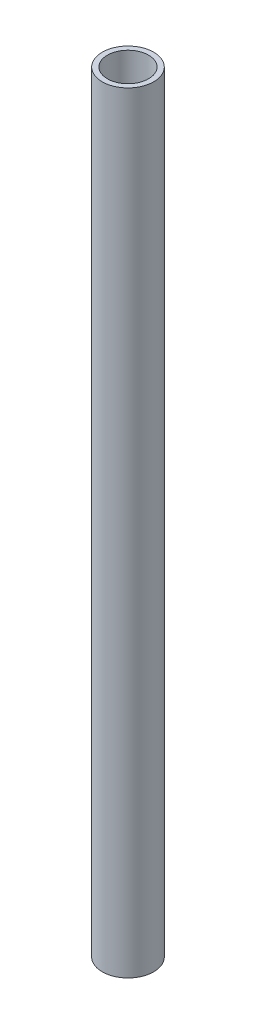
ISO-10303-21;
HEADER;
FILE_DESCRIPTION(('STEP AP214'),'2;1');
FILE_NAME('part.step','',(''),(''),'','','');
FILE_SCHEMA(('AUTOMOTIVE_DESIGN { 1 0 10303 214 1 1 1 1 }'));
ENDSEC;
DATA;
#1=APPLICATION_CONTEXT('core data for automotive mechanical design processes');
#2=APPLICATION_PROTOCOL_DEFINITION('international standard','automotive_design',2000,#1);
#3=PRODUCT_CONTEXT('',#1,'mechanical');
#4=PRODUCT('Part','Part','',(#3));
#5=PRODUCT_RELATED_PRODUCT_CATEGORY('part','',(#4));
#6=PRODUCT_DEFINITION_FORMATION('','',#4);
#7=PRODUCT_DEFINITION_CONTEXT('part definition',#1,'design');
#8=PRODUCT_DEFINITION('design','',#6,#7);
#9=PRODUCT_DEFINITION_SHAPE('','',#8);
#10=(LENGTH_UNIT() NAMED_UNIT(*) SI_UNIT(.MILLI.,.METRE.));
#11=(NAMED_UNIT(*) PLANE_ANGLE_UNIT() SI_UNIT($,.RADIAN.));
#12=(NAMED_UNIT(*) SI_UNIT($,.STERADIAN.) SOLID_ANGLE_UNIT());
#13=UNCERTAINTY_MEASURE_WITH_UNIT(LENGTH_MEASURE(1.E-05),#10,'distance_accuracy_value','');
#14=(GEOMETRIC_REPRESENTATION_CONTEXT(3) GLOBAL_UNCERTAINTY_ASSIGNED_CONTEXT((#13)) GLOBAL_UNIT_ASSIGNED_CONTEXT((#10,
#11,#12)) REPRESENTATION_CONTEXT('',''));
#15=CARTESIAN_POINT('',(0.,0.,0.));
#16=DIRECTION('',(0.,0.,1.));
#17=DIRECTION('',(1.,0.,0.));
#18=AXIS2_PLACEMENT_3D('',#15,#16,#17);
#19=CARTESIAN_POINT('',(0.,150.,0.));
#20=DIRECTION('',(0.,1.,0.));
#21=DIRECTION('',(0.,0.,1.));
#22=AXIS2_PLACEMENT_3D('',#19,#20,#21);
#23=PLANE('',#22);
#24=CARTESIAN_POINT('',(0.,150.,0.));
#25=DIRECTION('',(0.,1.,0.));
#26=DIRECTION('',(0.,0.,1.));
#27=AXIS2_PLACEMENT_3D('',#24,#25,#26);
#28=CIRCLE('',#27,5.);
#29=CARTESIAN_POINT('',(0.,150.,5.));
#30=VERTEX_POINT('',#29);
#31=EDGE_CURVE('E10',#30,#30,#28,.T.);
#32=ORIENTED_EDGE('',*,*,#31,.T.);
#33=EDGE_LOOP('',(#32));
#34=FACE_BOUND('',#33,.T.);
#35=CARTESIAN_POINT('',(0.,150.,0.));
#36=DIRECTION('',(0.,1.,0.));
#37=DIRECTION('',(0.,0.,1.));
#38=AXIS2_PLACEMENT_3D('',#35,#36,#37);
#39=CIRCLE('',#38,4.);
#40=CARTESIAN_POINT('',(0.,150.,4.));
#41=VERTEX_POINT('',#40);
#42=EDGE_CURVE('E42',#41,#41,#39,.T.);
#43=ORIENTED_EDGE('',*,*,#42,.F.);
#44=EDGE_LOOP('',(#43));
#45=FACE_BOUND('',#44,.T.);
#46=ADVANCED_FACE('F31',(#34,#45),#23,.T.);
#47=CARTESIAN_POINT('',(0.,0.,0.));
#48=DIRECTION('',(0.,1.,0.));
#49=DIRECTION('',(0.,0.,1.));
#50=AXIS2_PLACEMENT_3D('',#47,#48,#49);
#51=PLANE('',#50);
#52=CARTESIAN_POINT('',(0.,0.,0.));
#53=DIRECTION('',(0.,1.,0.));
#54=DIRECTION('',(0.,0.,1.));
#55=AXIS2_PLACEMENT_3D('',#52,#53,#54);
#56=CIRCLE('',#55,5.);
#57=CARTESIAN_POINT('',(0.,0.,5.));
#58=VERTEX_POINT('',#57);
#59=EDGE_CURVE('E35',#58,#58,#56,.T.);
#60=ORIENTED_EDGE('',*,*,#59,.F.);
#61=EDGE_LOOP('',(#60));
#62=FACE_BOUND('',#61,.T.);
#63=CARTESIAN_POINT('',(0.,0.,0.));
#64=DIRECTION('',(0.,1.,0.));
#65=DIRECTION('',(0.,0.,1.));
#66=AXIS2_PLACEMENT_3D('',#63,#64,#65);
#67=CIRCLE('',#66,4.);
#68=CARTESIAN_POINT('',(0.,0.,4.));
#69=VERTEX_POINT('',#68);
#70=EDGE_CURVE('E44',#69,#69,#67,.T.);
#71=ORIENTED_EDGE('',*,*,#70,.T.);
#72=EDGE_LOOP('',(#71));
#73=FACE_BOUND('',#72,.T.);
#74=ADVANCED_FACE('F54',(#62,#73),#51,.F.);
#75=CARTESIAN_POINT('',(0.,150.,0.));
#76=DIRECTION('',(0.,-1.,0.));
#77=DIRECTION('',(0.,0.,-1.));
#78=AXIS2_PLACEMENT_3D('',#75,#76,#77);
#79=CYLINDRICAL_SURFACE('',#78,5.);
#80=ORIENTED_EDGE('',*,*,#31,.F.);
#81=EDGE_LOOP('',(#80));
#82=FACE_BOUND('',#81,.T.);
#83=ORIENTED_EDGE('',*,*,#59,.T.);
#84=EDGE_LOOP('',(#83));
#85=FACE_BOUND('',#84,.T.);
#86=ADVANCED_FACE('F33',(#82,#85),#79,.T.);
#87=CARTESIAN_POINT('',(0.,150.,0.));
#88=DIRECTION('',(0.,-1.,0.));
#89=DIRECTION('',(0.,0.,-1.));
#90=AXIS2_PLACEMENT_3D('',#87,#88,#89);
#91=CYLINDRICAL_SURFACE('',#90,4.);
#92=ORIENTED_EDGE('',*,*,#42,.T.);
#93=EDGE_LOOP('',(#92));
#94=FACE_BOUND('',#93,.T.);
#95=ORIENTED_EDGE('',*,*,#70,.F.);
#96=EDGE_LOOP('',(#95));
#97=FACE_BOUND('',#96,.T.);
#98=ADVANCED_FACE('F50',(#94,#97),#91,.F.);
#99=CLOSED_SHELL('',(#46,#74,#86,#98));
#100=MANIFOLD_SOLID_BREP('B2',#99);
#101=ADVANCED_BREP_SHAPE_REPRESENTATION('',(#18,#100),#14);
#102=SHAPE_DEFINITION_REPRESENTATION(#9,#101);
ENDSEC;
END-ISO-10303-21;
